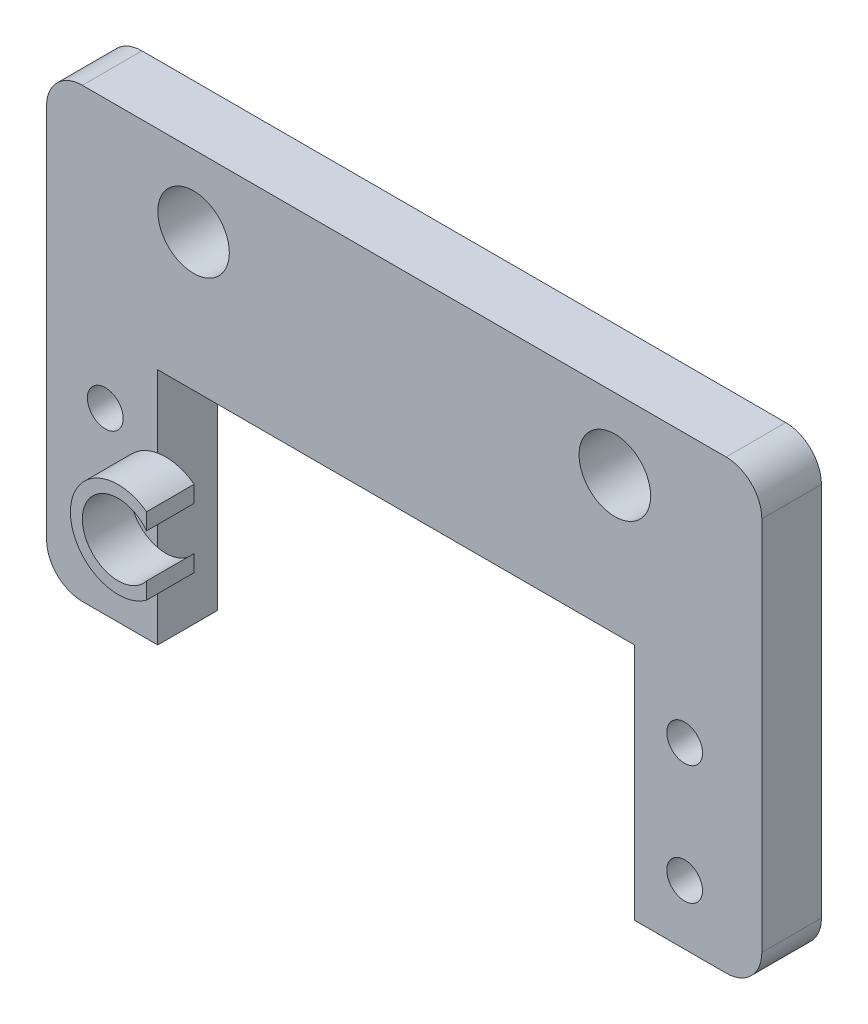
ISO-10303-21;
HEADER;
FILE_DESCRIPTION(('STEP AP214'),'2;1');
FILE_NAME('part.step','',(''),(''),'','','');
FILE_SCHEMA(('AUTOMOTIVE_DESIGN { 1 0 10303 214 1 1 1 1 }'));
ENDSEC;
DATA;
#1=APPLICATION_CONTEXT('core data for automotive mechanical design processes');
#2=APPLICATION_PROTOCOL_DEFINITION('international standard','automotive_design',2000,#1);
#3=PRODUCT_CONTEXT('',#1,'mechanical');
#4=PRODUCT('Part','Part','',(#3));
#5=PRODUCT_RELATED_PRODUCT_CATEGORY('part','',(#4));
#6=PRODUCT_DEFINITION_FORMATION('','',#4);
#7=PRODUCT_DEFINITION_CONTEXT('part definition',#1,'design');
#8=PRODUCT_DEFINITION('design','',#6,#7);
#9=PRODUCT_DEFINITION_SHAPE('','',#8);
#10=(LENGTH_UNIT() NAMED_UNIT(*) SI_UNIT(.MILLI.,.METRE.));
#11=(NAMED_UNIT(*) PLANE_ANGLE_UNIT() SI_UNIT($,.RADIAN.));
#12=(NAMED_UNIT(*) SI_UNIT($,.STERADIAN.) SOLID_ANGLE_UNIT());
#13=UNCERTAINTY_MEASURE_WITH_UNIT(LENGTH_MEASURE(1.E-05),#10,'distance_accuracy_value','');
#14=(GEOMETRIC_REPRESENTATION_CONTEXT(3) GLOBAL_UNCERTAINTY_ASSIGNED_CONTEXT((#13)) GLOBAL_UNIT_ASSIGNED_CONTEXT((#10,
#11,#12)) REPRESENTATION_CONTEXT('',''));
#15=CARTESIAN_POINT('',(0.,0.,0.));
#16=DIRECTION('',(0.,0.,1.));
#17=DIRECTION('',(1.,0.,0.));
#18=AXIS2_PLACEMENT_3D('',#15,#16,#17);
#19=CARTESIAN_POINT('',(-8.50000000000011,0.,5.));
#20=DIRECTION('',(0.,0.,1.));
#21=DIRECTION('',(1.,0.,0.));
#22=AXIS2_PLACEMENT_3D('',#19,#20,#21);
#23=PLANE('',#22);
#24=CARTESIAN_POINT('',(-8.50000000000011,0.,5.));
#25=DIRECTION('',(0.,0.,1.));
#26=DIRECTION('',(1.,0.,0.));
#27=AXIS2_PLACEMENT_3D('',#24,#25,#26);
#28=CIRCLE('',#27,4.);
#29=CARTESIAN_POINT('',(-6.1151179643437,3.21128287075482,5.));
#30=VERTEX_POINT('',#29);
#31=CARTESIAN_POINT('',(-9.17500000000001,3.94263553983882,5.));
#32=VERTEX_POINT('',#31);
#33=EDGE_CURVE('E185',#30,#32,#28,.T.);
#34=ORIENTED_EDGE('',*,*,#33,.F.);
#35=DIRECTION('',(0.,-1.,0.));
#36=VECTOR('',#35,1.);
#37=CARTESIAN_POINT('',(-6.1151179643437,3.21128287075482,5.));
#38=LINE('',#37,#36);
#39=CARTESIAN_POINT('',(-6.1151179643437,1.81998287794235,5.));
#40=VERTEX_POINT('',#39);
#41=EDGE_CURVE('E169',#30,#40,#38,.T.);
#42=ORIENTED_EDGE('',*,*,#41,.T.);
#43=CARTESIAN_POINT('',(-8.50000000000011,0.,5.));
#44=DIRECTION('',(0.,0.,1.));
#45=DIRECTION('',(1.,0.,0.));
#46=AXIS2_PLACEMENT_3D('',#43,#44,#45);
#47=CIRCLE('',#46,3.);
#48=CARTESIAN_POINT('',(-9.17500000000001,2.92307629048578,5.));
#49=VERTEX_POINT('',#48);
#50=EDGE_CURVE('E214',#40,#49,#47,.T.);
#51=ORIENTED_EDGE('',*,*,#50,.T.);
#52=DIRECTION('',(0.,1.,0.));
#53=VECTOR('',#52,1.);
#54=CARTESIAN_POINT('',(-9.17500000000001,10.,5.));
#55=LINE('',#54,#53);
#56=EDGE_CURVE('E188',#49,#32,#55,.T.);
#57=ORIENTED_EDGE('',*,*,#56,.T.);
#58=EDGE_LOOP('',(#34,#42,#51,#57));
#59=FACE_BOUND('',#58,.T.);
#60=ADVANCED_FACE('F50',(#59),#23,.F.);
#61=CARTESIAN_POINT('',(-15.5,-7.,5.));
#62=DIRECTION('',(0.,0.,1.));
#63=DIRECTION('',(1.,0.,0.));
#64=AXIS2_PLACEMENT_3D('',#61,#62,#63);
#65=PLANE('',#64);
#66=CARTESIAN_POINT('',(-9.17500000000001,-2.92307629048579,5.));
#67=VERTEX_POINT('',#66);
#68=EDGE_CURVE('E233',#67,#49,#55,.T.);
#69=ORIENTED_EDGE('',*,*,#68,.T.);
#70=EDGE_CURVE('E200',#49,#67,#47,.T.);
#71=ORIENTED_EDGE('',*,*,#70,.T.);
#72=EDGE_LOOP('',(#69,#71));
#73=FACE_BOUND('',#72,.T.);
#74=ADVANCED_FACE('F232',(#73),#65,.T.);
#75=CARTESIAN_POINT('',(-9.17500000000001,-3.94263553983882,5.));
#76=VERTEX_POINT('',#75);
#77=EDGE_CURVE('E192',#32,#76,#28,.T.);
#78=ORIENTED_EDGE('',*,*,#77,.F.);
#79=CARTESIAN_POINT('',(-9.17500000000001,10.,5.));
#80=VERTEX_POINT('',#79);
#81=EDGE_CURVE('E231',#32,#80,#55,.T.);
#82=ORIENTED_EDGE('',*,*,#81,.T.);
#83=DIRECTION('',(1.,0.,0.));
#84=VECTOR('',#83,1.);
#85=CARTESIAN_POINT('',(30.825,10.,5.));
#86=LINE('',#85,#84);
#87=CARTESIAN_POINT('',(30.825,10.,5.));
#88=VERTEX_POINT('',#87);
#89=EDGE_CURVE('E239',#80,#88,#86,.T.);
#90=ORIENTED_EDGE('',*,*,#89,.T.);
#91=DIRECTION('',(0.,-1.,0.));
#92=VECTOR('',#91,1.);
#93=CARTESIAN_POINT('',(30.825,10.,5.));
#94=LINE('',#93,#92);
#95=CARTESIAN_POINT('',(30.825,-9.99999999999999,5.));
#96=VERTEX_POINT('',#95);
#97=EDGE_CURVE('E242',#88,#96,#94,.T.);
#98=ORIENTED_EDGE('',*,*,#97,.T.);
#99=DIRECTION('',(1.,0.,0.));
#100=VECTOR('',#99,1.);
#101=CARTESIAN_POINT('',(33.3,-9.99999999999999,5.));
#102=LINE('',#101,#100);
#103=CARTESIAN_POINT('',(38.5,-9.99999999999999,5.));
#104=VERTEX_POINT('',#103);
#105=EDGE_CURVE('E271',#96,#104,#102,.T.);
#106=ORIENTED_EDGE('',*,*,#105,.T.);
#107=CARTESIAN_POINT('',(38.5,-6.99999999999999,5.));
#108=DIRECTION('',(0.,0.,1.));
#109=DIRECTION('',(1.,0.,0.));
#110=AXIS2_PLACEMENT_3D('',#107,#108,#109);
#111=CIRCLE('',#110,3.);
#112=CARTESIAN_POINT('',(41.5,-6.99999999999997,5.));
#113=VERTEX_POINT('',#112);
#114=EDGE_CURVE('E345',#104,#113,#111,.T.);
#115=ORIENTED_EDGE('',*,*,#114,.T.);
#116=DIRECTION('',(0.,1.,0.));
#117=VECTOR('',#116,1.);
#118=CARTESIAN_POINT('',(41.5,24.5,5.));
#119=LINE('',#118,#117);
#120=CARTESIAN_POINT('',(41.5,24.5,5.));
#121=VERTEX_POINT('',#120);
#122=EDGE_CURVE('E342',#113,#121,#119,.T.);
#123=ORIENTED_EDGE('',*,*,#122,.T.);
#124=CARTESIAN_POINT('',(38.5,24.5,5.));
#125=DIRECTION('',(0.,0.,1.));
#126=DIRECTION('',(-1.,0.,0.));
#127=AXIS2_PLACEMENT_3D('',#124,#125,#126);
#128=CIRCLE('',#127,3.);
#129=CARTESIAN_POINT('',(38.5,27.5,5.));
#130=VERTEX_POINT('',#129);
#131=EDGE_CURVE('E350',#121,#130,#128,.T.);
#132=ORIENTED_EDGE('',*,*,#131,.T.);
#133=DIRECTION('',(-1.,0.,0.));
#134=VECTOR('',#133,1.);
#135=CARTESIAN_POINT('',(-15.5,27.5,5.));
#136=LINE('',#135,#134);
#137=CARTESIAN_POINT('',(-15.5,27.5,5.));
#138=VERTEX_POINT('',#137);
#139=EDGE_CURVE('E349',#130,#138,#136,.T.);
#140=ORIENTED_EDGE('',*,*,#139,.T.);
#141=CARTESIAN_POINT('',(-15.5,24.5,5.));
#142=DIRECTION('',(0.,0.,1.));
#143=DIRECTION('',(1.,0.,0.));
#144=AXIS2_PLACEMENT_3D('',#141,#142,#143);
#145=CIRCLE('',#144,3.);
#146=CARTESIAN_POINT('',(-18.5,24.5,5.));
#147=VERTEX_POINT('',#146);
#148=EDGE_CURVE('E353',#138,#147,#145,.T.);
#149=ORIENTED_EDGE('',*,*,#148,.T.);
#150=DIRECTION('',(0.,-1.,0.));
#151=VECTOR('',#150,1.);
#152=CARTESIAN_POINT('',(-18.5,24.5,5.));
#153=LINE('',#152,#151);
#154=CARTESIAN_POINT('',(-18.5,-6.99999999999998,5.));
#155=VERTEX_POINT('',#154);
#156=EDGE_CURVE('E352',#147,#155,#153,.T.);
#157=ORIENTED_EDGE('',*,*,#156,.T.);
#158=CARTESIAN_POINT('',(-15.5,-7.,5.));
#159=DIRECTION('',(0.,0.,1.));
#160=DIRECTION('',(1.,0.,0.));
#161=AXIS2_PLACEMENT_3D('',#158,#159,#160);
#162=CIRCLE('',#161,3.);
#163=CARTESIAN_POINT('',(-15.5,-10.,5.));
#164=VERTEX_POINT('',#163);
#165=EDGE_CURVE('E355',#155,#164,#162,.T.);
#166=ORIENTED_EDGE('',*,*,#165,.T.);
#167=DIRECTION('',(1.,0.,0.));
#168=VECTOR('',#167,1.);
#169=CARTESIAN_POINT('',(-15.5,-10.,5.));
#170=LINE('',#169,#168);
#171=CARTESIAN_POINT('',(-9.17500000000001,-10.,5.));
#172=VERTEX_POINT('',#171);
#173=EDGE_CURVE('E241',#164,#172,#170,.T.);
#174=ORIENTED_EDGE('',*,*,#173,.T.);
#175=EDGE_CURVE('E236',#172,#76,#55,.T.);
#176=ORIENTED_EDGE('',*,*,#175,.T.);
#177=EDGE_LOOP('',(#78,#82,#90,#98,#106,#115,#123,#132,#140,#149,#157,#166,#174,#176));
#178=FACE_BOUND('',#177,.T.);
#179=CARTESIAN_POINT('',(-6.17,21.5,5.));
#180=DIRECTION('',(0.,0.,1.));
#181=DIRECTION('',(1.,0.,0.));
#182=AXIS2_PLACEMENT_3D('',#179,#180,#181);
#183=CIRCLE('',#182,3.);
#184=CARTESIAN_POINT('',(-3.17,21.5,5.));
#185=VERTEX_POINT('',#184);
#186=EDGE_CURVE('E207',#185,#185,#183,.T.);
#187=ORIENTED_EDGE('',*,*,#186,.F.);
#188=EDGE_LOOP('',(#187));
#189=FACE_BOUND('',#188,.T.);
#190=CARTESIAN_POINT('',(29.17,21.5,5.));
#191=DIRECTION('',(0.,0.,1.));
#192=DIRECTION('',(1.,0.,0.));
#193=AXIS2_PLACEMENT_3D('',#190,#191,#192);
#194=CIRCLE('',#193,3.);
#195=CARTESIAN_POINT('',(32.17,21.5,5.));
#196=VERTEX_POINT('',#195);
#197=EDGE_CURVE('E204',#196,#196,#194,.T.);
#198=ORIENTED_EDGE('',*,*,#197,.F.);
#199=EDGE_LOOP('',(#198));
#200=FACE_BOUND('',#199,.T.);
#201=CARTESIAN_POINT('',(35.025,5.,5.));
#202=DIRECTION('',(0.,0.,1.));
#203=DIRECTION('',(1.,0.,0.));
#204=AXIS2_PLACEMENT_3D('',#201,#202,#203);
#205=CIRCLE('',#204,1.5);
#206=CARTESIAN_POINT('',(36.525,5.,5.));
#207=VERTEX_POINT('',#206);
#208=EDGE_CURVE('E327',#207,#207,#205,.T.);
#209=ORIENTED_EDGE('',*,*,#208,.F.);
#210=EDGE_LOOP('',(#209));
#211=FACE_BOUND('',#210,.T.);
#212=CARTESIAN_POINT('',(-13.575,5.,5.));
#213=DIRECTION('',(0.,0.,1.));
#214=DIRECTION('',(1.,0.,0.));
#215=AXIS2_PLACEMENT_3D('',#212,#213,#214);
#216=CIRCLE('',#215,1.5);
#217=CARTESIAN_POINT('',(-12.075,5.,5.));
#218=VERTEX_POINT('',#217);
#219=EDGE_CURVE('E249',#218,#218,#216,.T.);
#220=ORIENTED_EDGE('',*,*,#219,.F.);
#221=EDGE_LOOP('',(#220));
#222=FACE_BOUND('',#221,.T.);
#223=CARTESIAN_POINT('',(-13.575,-5.00000000000001,5.));
#224=DIRECTION('',(0.,0.,1.));
#225=DIRECTION('',(1.,0.,0.));
#226=AXIS2_PLACEMENT_3D('',#223,#224,#225);
#227=CIRCLE('',#226,1.5);
#228=CARTESIAN_POINT('',(-12.075,-5.00000000000001,5.));
#229=VERTEX_POINT('',#228);
#230=EDGE_CURVE('E334',#229,#229,#227,.T.);
#231=ORIENTED_EDGE('',*,*,#230,.F.);
#232=EDGE_LOOP('',(#231));
#233=FACE_BOUND('',#232,.T.);
#234=CARTESIAN_POINT('',(35.025,-5.,5.));
#235=DIRECTION('',(0.,0.,1.));
#236=DIRECTION('',(1.,0.,0.));
#237=AXIS2_PLACEMENT_3D('',#234,#235,#236);
#238=CIRCLE('',#237,1.5);
#239=CARTESIAN_POINT('',(36.525,-5.,5.));
#240=VERTEX_POINT('',#239);
#241=EDGE_CURVE('E319',#240,#240,#238,.T.);
#242=ORIENTED_EDGE('',*,*,#241,.F.);
#243=EDGE_LOOP('',(#242));
#244=FACE_BOUND('',#243,.T.);
#245=ADVANCED_FACE('F359',(#178,#189,#200,#211,#222,#233,#244),#65,.T.);
#246=CARTESIAN_POINT('',(-15.5,-7.,0.));
#247=DIRECTION('',(0.,0.,1.));
#248=DIRECTION('',(1.,0.,0.));
#249=AXIS2_PLACEMENT_3D('',#246,#247,#248);
#250=PLANE('',#249);
#251=CARTESIAN_POINT('',(-6.17,21.5,0.));
#252=DIRECTION('',(0.,0.,1.));
#253=DIRECTION('',(1.,0.,0.));
#254=AXIS2_PLACEMENT_3D('',#251,#252,#253);
#255=CIRCLE('',#254,3.);
#256=CARTESIAN_POINT('',(-3.17,21.5,0.));
#257=VERTEX_POINT('',#256);
#258=EDGE_CURVE('E315',#257,#257,#255,.T.);
#259=ORIENTED_EDGE('',*,*,#258,.T.);
#260=EDGE_LOOP('',(#259));
#261=FACE_BOUND('',#260,.T.);
#262=CARTESIAN_POINT('',(29.17,21.5,0.));
#263=DIRECTION('',(0.,0.,1.));
#264=DIRECTION('',(1.,0.,0.));
#265=AXIS2_PLACEMENT_3D('',#262,#263,#264);
#266=CIRCLE('',#265,3.);
#267=CARTESIAN_POINT('',(32.17,21.5,0.));
#268=VERTEX_POINT('',#267);
#269=EDGE_CURVE('E307',#268,#268,#266,.T.);
#270=ORIENTED_EDGE('',*,*,#269,.T.);
#271=EDGE_LOOP('',(#270));
#272=FACE_BOUND('',#271,.T.);
#273=DIRECTION('',(1.,0.,0.));
#274=VECTOR('',#273,1.);
#275=CARTESIAN_POINT('',(33.3,-9.99999999999999,0.));
#276=LINE('',#275,#274);
#277=CARTESIAN_POINT('',(30.825,-9.99999999999999,0.));
#278=VERTEX_POINT('',#277);
#279=CARTESIAN_POINT('',(38.5,-9.99999999999999,0.));
#280=VERTEX_POINT('',#279);
#281=EDGE_CURVE('E250',#278,#280,#276,.T.);
#282=ORIENTED_EDGE('',*,*,#281,.F.);
#283=DIRECTION('',(0.,-1.,0.));
#284=VECTOR('',#283,1.);
#285=CARTESIAN_POINT('',(30.825,10.,0.));
#286=LINE('',#285,#284);
#287=CARTESIAN_POINT('',(30.825,10.,0.));
#288=VERTEX_POINT('',#287);
#289=EDGE_CURVE('E266',#288,#278,#286,.T.);
#290=ORIENTED_EDGE('',*,*,#289,.F.);
#291=DIRECTION('',(1.,0.,0.));
#292=VECTOR('',#291,1.);
#293=CARTESIAN_POINT('',(30.825,10.,0.));
#294=LINE('',#293,#292);
#295=CARTESIAN_POINT('',(-9.17500000000001,10.,0.));
#296=VERTEX_POINT('',#295);
#297=EDGE_CURVE('E267',#296,#288,#294,.T.);
#298=ORIENTED_EDGE('',*,*,#297,.F.);
#299=DIRECTION('',(0.,1.,0.));
#300=VECTOR('',#299,1.);
#301=CARTESIAN_POINT('',(-9.17500000000001,10.,0.));
#302=LINE('',#301,#300);
#303=CARTESIAN_POINT('',(-9.17500000000001,-10.,0.));
#304=VERTEX_POINT('',#303);
#305=EDGE_CURVE('E268',#304,#296,#302,.T.);
#306=ORIENTED_EDGE('',*,*,#305,.F.);
#307=DIRECTION('',(1.,0.,0.));
#308=VECTOR('',#307,1.);
#309=CARTESIAN_POINT('',(-15.5,-10.,0.));
#310=LINE('',#309,#308);
#311=CARTESIAN_POINT('',(-15.5,-10.,0.));
#312=VERTEX_POINT('',#311);
#313=EDGE_CURVE('E264',#312,#304,#310,.T.);
#314=ORIENTED_EDGE('',*,*,#313,.F.);
#315=CARTESIAN_POINT('',(-15.5,-7.,0.));
#316=DIRECTION('',(0.,0.,1.));
#317=DIRECTION('',(1.,0.,0.));
#318=AXIS2_PLACEMENT_3D('',#315,#316,#317);
#319=CIRCLE('',#318,3.);
#320=CARTESIAN_POINT('',(-18.5,-6.99999999999998,0.));
#321=VERTEX_POINT('',#320);
#322=EDGE_CURVE('E265',#321,#312,#319,.T.);
#323=ORIENTED_EDGE('',*,*,#322,.F.);
#324=DIRECTION('',(0.,-1.,0.));
#325=VECTOR('',#324,1.);
#326=CARTESIAN_POINT('',(-18.5,24.5,0.));
#327=LINE('',#326,#325);
#328=CARTESIAN_POINT('',(-18.5,24.5,0.));
#329=VERTEX_POINT('',#328);
#330=EDGE_CURVE('E257',#329,#321,#327,.T.);
#331=ORIENTED_EDGE('',*,*,#330,.F.);
#332=CARTESIAN_POINT('',(-15.5,24.5,0.));
#333=DIRECTION('',(0.,0.,1.));
#334=DIRECTION('',(1.,0.,0.));
#335=AXIS2_PLACEMENT_3D('',#332,#333,#334);
#336=CIRCLE('',#335,3.);
#337=CARTESIAN_POINT('',(-15.5,27.5,0.));
#338=VERTEX_POINT('',#337);
#339=EDGE_CURVE('E260',#338,#329,#336,.T.);
#340=ORIENTED_EDGE('',*,*,#339,.F.);
#341=DIRECTION('',(-1.,0.,0.));
#342=VECTOR('',#341,1.);
#343=CARTESIAN_POINT('',(-15.5,27.5,0.));
#344=LINE('',#343,#342);
#345=CARTESIAN_POINT('',(38.5,27.5,0.));
#346=VERTEX_POINT('',#345);
#347=EDGE_CURVE('E259',#346,#338,#344,.T.);
#348=ORIENTED_EDGE('',*,*,#347,.F.);
#349=CARTESIAN_POINT('',(38.5,24.5,0.));
#350=DIRECTION('',(0.,0.,1.));
#351=DIRECTION('',(-1.,0.,0.));
#352=AXIS2_PLACEMENT_3D('',#349,#350,#351);
#353=CIRCLE('',#352,3.);
#354=CARTESIAN_POINT('',(41.5,24.5,0.));
#355=VERTEX_POINT('',#354);
#356=EDGE_CURVE('E251',#355,#346,#353,.T.);
#357=ORIENTED_EDGE('',*,*,#356,.F.);
#358=DIRECTION('',(0.,1.,0.));
#359=VECTOR('',#358,1.);
#360=CARTESIAN_POINT('',(41.5,24.5,0.));
#361=LINE('',#360,#359);
#362=CARTESIAN_POINT('',(41.5,-6.99999999999997,0.));
#363=VERTEX_POINT('',#362);
#364=EDGE_CURVE('E255',#363,#355,#361,.T.);
#365=ORIENTED_EDGE('',*,*,#364,.F.);
#366=CARTESIAN_POINT('',(38.5,-6.99999999999999,0.));
#367=DIRECTION('',(0.,0.,1.));
#368=DIRECTION('',(1.,0.,0.));
#369=AXIS2_PLACEMENT_3D('',#366,#367,#368);
#370=CIRCLE('',#369,3.);
#371=EDGE_CURVE('E248',#280,#363,#370,.T.);
#372=ORIENTED_EDGE('',*,*,#371,.F.);
#373=EDGE_LOOP('',(#282,#290,#298,#306,#314,#323,#331,#340,#348,#357,#365,#372));
#374=FACE_BOUND('',#373,.T.);
#375=CARTESIAN_POINT('',(-13.575,5.,0.));
#376=DIRECTION('',(0.,0.,1.));
#377=DIRECTION('',(1.,0.,0.));
#378=AXIS2_PLACEMENT_3D('',#375,#376,#377);
#379=CIRCLE('',#378,1.5);
#380=CARTESIAN_POINT('',(-12.075,5.,0.));
#381=VERTEX_POINT('',#380);
#382=EDGE_CURVE('E331',#381,#381,#379,.T.);
#383=ORIENTED_EDGE('',*,*,#382,.T.);
#384=EDGE_LOOP('',(#383));
#385=FACE_BOUND('',#384,.T.);
#386=CARTESIAN_POINT('',(-13.575,-5.00000000000001,0.));
#387=DIRECTION('',(0.,0.,1.));
#388=DIRECTION('',(1.,0.,0.));
#389=AXIS2_PLACEMENT_3D('',#386,#387,#388);
#390=CIRCLE('',#389,1.5);
#391=CARTESIAN_POINT('',(-12.075,-5.00000000000001,0.));
#392=VERTEX_POINT('',#391);
#393=EDGE_CURVE('E329',#392,#392,#390,.T.);
#394=ORIENTED_EDGE('',*,*,#393,.T.);
#395=EDGE_LOOP('',(#394));
#396=FACE_BOUND('',#395,.T.);
#397=CARTESIAN_POINT('',(35.025,5.,0.));
#398=DIRECTION('',(0.,0.,1.));
#399=DIRECTION('',(1.,0.,0.));
#400=AXIS2_PLACEMENT_3D('',#397,#398,#399);
#401=CIRCLE('',#400,1.5);
#402=CARTESIAN_POINT('',(36.525,5.,0.));
#403=VERTEX_POINT('',#402);
#404=EDGE_CURVE('E325',#403,#403,#401,.T.);
#405=ORIENTED_EDGE('',*,*,#404,.T.);
#406=EDGE_LOOP('',(#405));
#407=FACE_BOUND('',#406,.T.);
#408=CARTESIAN_POINT('',(35.025,-5.,0.));
#409=DIRECTION('',(0.,0.,1.));
#410=DIRECTION('',(1.,0.,0.));
#411=AXIS2_PLACEMENT_3D('',#408,#409,#410);
#412=CIRCLE('',#411,1.5);
#413=CARTESIAN_POINT('',(36.525,-5.,0.));
#414=VERTEX_POINT('',#413);
#415=EDGE_CURVE('E313',#414,#414,#412,.T.);
#416=ORIENTED_EDGE('',*,*,#415,.T.);
#417=EDGE_LOOP('',(#416));
#418=FACE_BOUND('',#417,.T.);
#419=ADVANCED_FACE('F414',(#261,#272,#374,#385,#396,#407,#418),#250,.F.);
#420=CARTESIAN_POINT('',(33.3,-9.99999999999999,5.));
#421=DIRECTION('',(0.,1.,0.));
#422=DIRECTION('',(0.,0.,1.));
#423=AXIS2_PLACEMENT_3D('',#420,#421,#422);
#424=PLANE('',#423);
#425=ORIENTED_EDGE('',*,*,#281,.T.);
#426=DIRECTION('',(0.,0.,-1.));
#427=VECTOR('',#426,1.);
#428=CARTESIAN_POINT('',(38.5,-9.99999999999999,5.));
#429=LINE('',#428,#427);
#430=EDGE_CURVE('E306',#104,#280,#429,.T.);
#431=ORIENTED_EDGE('',*,*,#430,.F.);
#432=ORIENTED_EDGE('',*,*,#105,.F.);
#433=DIRECTION('',(0.,0.,-1.));
#434=VECTOR('',#433,1.);
#435=CARTESIAN_POINT('',(30.825,-9.99999999999999,5.));
#436=LINE('',#435,#434);
#437=EDGE_CURVE('E246',#96,#278,#436,.T.);
#438=ORIENTED_EDGE('',*,*,#437,.T.);
#439=EDGE_LOOP('',(#425,#431,#432,#438));
#440=FACE_BOUND('',#439,.T.);
#441=ADVANCED_FACE('F47',(#440),#424,.F.);
#442=CARTESIAN_POINT('',(38.5,-6.99999999999999,5.));
#443=DIRECTION('',(0.,0.,-1.));
#444=DIRECTION('',(-1.,0.,0.));
#445=AXIS2_PLACEMENT_3D('',#442,#443,#444);
#446=CYLINDRICAL_SURFACE('',#445,3.);
#447=ORIENTED_EDGE('',*,*,#371,.T.);
#448=DIRECTION('',(0.,0.,-1.));
#449=VECTOR('',#448,1.);
#450=CARTESIAN_POINT('',(41.5,-6.99999999999997,5.));
#451=LINE('',#450,#449);
#452=EDGE_CURVE('E303',#113,#363,#451,.T.);
#453=ORIENTED_EDGE('',*,*,#452,.F.);
#454=ORIENTED_EDGE('',*,*,#114,.F.);
#455=ORIENTED_EDGE('',*,*,#430,.T.);
#456=EDGE_LOOP('',(#447,#453,#454,#455));
#457=FACE_BOUND('',#456,.T.);
#458=ADVANCED_FACE('F379',(#457),#446,.T.);
#459=CARTESIAN_POINT('',(41.5,24.5,5.));
#460=DIRECTION('',(-1.,0.,0.));
#461=DIRECTION('',(0.,-1.,0.));
#462=AXIS2_PLACEMENT_3D('',#459,#460,#461);
#463=PLANE('',#462);
#464=ORIENTED_EDGE('',*,*,#364,.T.);
#465=DIRECTION('',(0.,0.,-1.));
#466=VECTOR('',#465,1.);
#467=CARTESIAN_POINT('',(41.5,24.5,5.));
#468=LINE('',#467,#466);
#469=EDGE_CURVE('E297',#121,#355,#468,.T.);
#470=ORIENTED_EDGE('',*,*,#469,.F.);
#471=ORIENTED_EDGE('',*,*,#122,.F.);
#472=ORIENTED_EDGE('',*,*,#452,.T.);
#473=EDGE_LOOP('',(#464,#470,#471,#472));
#474=FACE_BOUND('',#473,.T.);
#475=ADVANCED_FACE('F383',(#474),#463,.F.);
#476=CARTESIAN_POINT('',(38.5,24.5,5.));
#477=DIRECTION('',(0.,0.,-1.));
#478=DIRECTION('',(-1.,0.,0.));
#479=AXIS2_PLACEMENT_3D('',#476,#477,#478);
#480=CYLINDRICAL_SURFACE('',#479,3.);
#481=ORIENTED_EDGE('',*,*,#356,.T.);
#482=DIRECTION('',(0.,0.,-1.));
#483=VECTOR('',#482,1.);
#484=CARTESIAN_POINT('',(38.5,27.5,5.));
#485=LINE('',#484,#483);
#486=EDGE_CURVE('E300',#130,#346,#485,.T.);
#487=ORIENTED_EDGE('',*,*,#486,.F.);
#488=ORIENTED_EDGE('',*,*,#131,.F.);
#489=ORIENTED_EDGE('',*,*,#469,.T.);
#490=EDGE_LOOP('',(#481,#487,#488,#489));
#491=FACE_BOUND('',#490,.T.);
#492=ADVANCED_FACE('F392',(#491),#480,.T.);
#493=CARTESIAN_POINT('',(-15.5,27.5,5.));
#494=DIRECTION('',(0.,-1.,0.));
#495=DIRECTION('',(1.,0.,0.));
#496=AXIS2_PLACEMENT_3D('',#493,#494,#495);
#497=PLANE('',#496);
#498=ORIENTED_EDGE('',*,*,#347,.T.);
#499=DIRECTION('',(0.,0.,-1.));
#500=VECTOR('',#499,1.);
#501=CARTESIAN_POINT('',(-15.5,27.5,5.));
#502=LINE('',#501,#500);
#503=EDGE_CURVE('E295',#138,#338,#502,.T.);
#504=ORIENTED_EDGE('',*,*,#503,.F.);
#505=ORIENTED_EDGE('',*,*,#139,.F.);
#506=ORIENTED_EDGE('',*,*,#486,.T.);
#507=EDGE_LOOP('',(#498,#504,#505,#506));
#508=FACE_BOUND('',#507,.T.);
#509=ADVANCED_FACE('F391',(#508),#497,.F.);
#510=CARTESIAN_POINT('',(-15.5,24.5,5.));
#511=DIRECTION('',(0.,0.,-1.));
#512=DIRECTION('',(-1.,0.,0.));
#513=AXIS2_PLACEMENT_3D('',#510,#511,#512);
#514=CYLINDRICAL_SURFACE('',#513,3.);
#515=ORIENTED_EDGE('',*,*,#339,.T.);
#516=DIRECTION('',(0.,0.,-1.));
#517=VECTOR('',#516,1.);
#518=CARTESIAN_POINT('',(-18.5,24.5,5.));
#519=LINE('',#518,#517);
#520=EDGE_CURVE('E293',#147,#329,#519,.T.);
#521=ORIENTED_EDGE('',*,*,#520,.F.);
#522=ORIENTED_EDGE('',*,*,#148,.F.);
#523=ORIENTED_EDGE('',*,*,#503,.T.);
#524=EDGE_LOOP('',(#515,#521,#522,#523));
#525=FACE_BOUND('',#524,.T.);
#526=ADVANCED_FACE('F396',(#525),#514,.T.);
#527=CARTESIAN_POINT('',(-18.5,24.5,5.));
#528=DIRECTION('',(1.,0.,0.));
#529=DIRECTION('',(0.,1.,0.));
#530=AXIS2_PLACEMENT_3D('',#527,#528,#529);
#531=PLANE('',#530);
#532=ORIENTED_EDGE('',*,*,#330,.T.);
#533=DIRECTION('',(0.,0.,-1.));
#534=VECTOR('',#533,1.);
#535=CARTESIAN_POINT('',(-18.5,-6.99999999999998,5.));
#536=LINE('',#535,#534);
#537=EDGE_CURVE('E287',#155,#321,#536,.T.);
#538=ORIENTED_EDGE('',*,*,#537,.F.);
#539=ORIENTED_EDGE('',*,*,#156,.F.);
#540=ORIENTED_EDGE('',*,*,#520,.T.);
#541=EDGE_LOOP('',(#532,#538,#539,#540));
#542=FACE_BOUND('',#541,.T.);
#543=ADVANCED_FACE('F404',(#542),#531,.F.);
#544=CARTESIAN_POINT('',(-15.5,-7.,5.));
#545=DIRECTION('',(0.,0.,-1.));
#546=DIRECTION('',(-1.,0.,0.));
#547=AXIS2_PLACEMENT_3D('',#544,#545,#546);
#548=CYLINDRICAL_SURFACE('',#547,3.);
#549=ORIENTED_EDGE('',*,*,#322,.T.);
#550=DIRECTION('',(0.,0.,-1.));
#551=VECTOR('',#550,1.);
#552=CARTESIAN_POINT('',(-15.5,-10.,5.));
#553=LINE('',#552,#551);
#554=EDGE_CURVE('E281',#164,#312,#553,.T.);
#555=ORIENTED_EDGE('',*,*,#554,.F.);
#556=ORIENTED_EDGE('',*,*,#165,.F.);
#557=ORIENTED_EDGE('',*,*,#537,.T.);
#558=EDGE_LOOP('',(#549,#555,#556,#557));
#559=FACE_BOUND('',#558,.T.);
#560=ADVANCED_FACE('F410',(#559),#548,.T.);
#561=CARTESIAN_POINT('',(-15.5,-10.,5.));
#562=DIRECTION('',(0.,1.,0.));
#563=DIRECTION('',(0.,0.,1.));
#564=AXIS2_PLACEMENT_3D('',#561,#562,#563);
#565=PLANE('',#564);
#566=ORIENTED_EDGE('',*,*,#313,.T.);
#567=DIRECTION('',(0.,0.,-1.));
#568=VECTOR('',#567,1.);
#569=CARTESIAN_POINT('',(-9.17500000000001,-10.,5.));
#570=LINE('',#569,#568);
#571=EDGE_CURVE('E285',#172,#304,#570,.T.);
#572=ORIENTED_EDGE('',*,*,#571,.F.);
#573=ORIENTED_EDGE('',*,*,#173,.F.);
#574=ORIENTED_EDGE('',*,*,#554,.T.);
#575=EDGE_LOOP('',(#566,#572,#573,#574));
#576=FACE_BOUND('',#575,.T.);
#577=ADVANCED_FACE('F412',(#576),#565,.F.);
#578=CARTESIAN_POINT('',(-9.17500000000001,10.,5.));
#579=DIRECTION('',(-1.,0.,0.));
#580=DIRECTION('',(0.,-1.,0.));
#581=AXIS2_PLACEMENT_3D('',#578,#579,#580);
#582=PLANE('',#581);
#583=ORIENTED_EDGE('',*,*,#305,.T.);
#584=DIRECTION('',(0.,0.,-1.));
#585=VECTOR('',#584,1.);
#586=CARTESIAN_POINT('',(-9.17500000000001,10.,5.));
#587=LINE('',#586,#585);
#588=EDGE_CURVE('E278',#80,#296,#587,.T.);
#589=ORIENTED_EDGE('',*,*,#588,.F.);
#590=ORIENTED_EDGE('',*,*,#81,.F.);
#591=ORIENTED_EDGE('',*,*,#56,.F.);
#592=ORIENTED_EDGE('',*,*,#68,.F.);
#593=EDGE_CURVE('E223',#76,#67,#55,.T.);
#594=ORIENTED_EDGE('',*,*,#593,.F.);
#595=ORIENTED_EDGE('',*,*,#175,.F.);
#596=ORIENTED_EDGE('',*,*,#571,.T.);
#597=EDGE_LOOP('',(#583,#589,#590,#591,#592,#594,#595,#596));
#598=FACE_BOUND('',#597,.T.);
#599=ADVANCED_FACE('F229',(#598),#582,.F.);
#600=CARTESIAN_POINT('',(30.825,10.,5.));
#601=DIRECTION('',(0.,1.,0.));
#602=DIRECTION('',(-1.,0.,0.));
#603=AXIS2_PLACEMENT_3D('',#600,#601,#602);
#604=PLANE('',#603);
#605=ORIENTED_EDGE('',*,*,#297,.T.);
#606=DIRECTION('',(0.,0.,-1.));
#607=VECTOR('',#606,1.);
#608=CARTESIAN_POINT('',(30.825,10.,5.));
#609=LINE('',#608,#607);
#610=EDGE_CURVE('E279',#88,#288,#609,.T.);
#611=ORIENTED_EDGE('',*,*,#610,.F.);
#612=ORIENTED_EDGE('',*,*,#89,.F.);
#613=ORIENTED_EDGE('',*,*,#588,.T.);
#614=EDGE_LOOP('',(#605,#611,#612,#613));
#615=FACE_BOUND('',#614,.T.);
#616=ADVANCED_FACE('F370',(#615),#604,.F.);
#617=CARTESIAN_POINT('',(30.825,10.,5.));
#618=DIRECTION('',(1.,0.,0.));
#619=DIRECTION('',(0.,1.,0.));
#620=AXIS2_PLACEMENT_3D('',#617,#618,#619);
#621=PLANE('',#620);
#622=ORIENTED_EDGE('',*,*,#289,.T.);
#623=ORIENTED_EDGE('',*,*,#437,.F.);
#624=ORIENTED_EDGE('',*,*,#97,.F.);
#625=ORIENTED_EDGE('',*,*,#610,.T.);
#626=EDGE_LOOP('',(#622,#623,#624,#625));
#627=FACE_BOUND('',#626,.T.);
#628=ADVANCED_FACE('F375',(#627),#621,.F.);
#629=CARTESIAN_POINT('',(-13.575,5.,5.));
#630=DIRECTION('',(0.,0.,-1.));
#631=DIRECTION('',(-1.,0.,0.));
#632=AXIS2_PLACEMENT_3D('',#629,#630,#631);
#633=CYLINDRICAL_SURFACE('',#632,1.5);
#634=ORIENTED_EDGE('',*,*,#219,.T.);
#635=EDGE_LOOP('',(#634));
#636=FACE_BOUND('',#635,.T.);
#637=ORIENTED_EDGE('',*,*,#382,.F.);
#638=EDGE_LOOP('',(#637));
#639=FACE_BOUND('',#638,.T.);
#640=ADVANCED_FACE('F440',(#636,#639),#633,.F.);
#641=CARTESIAN_POINT('',(-13.575,-5.00000000000001,5.));
#642=DIRECTION('',(0.,0.,-1.));
#643=DIRECTION('',(-1.,0.,0.));
#644=AXIS2_PLACEMENT_3D('',#641,#642,#643);
#645=CYLINDRICAL_SURFACE('',#644,1.5);
#646=ORIENTED_EDGE('',*,*,#230,.T.);
#647=EDGE_LOOP('',(#646));
#648=FACE_BOUND('',#647,.T.);
#649=ORIENTED_EDGE('',*,*,#393,.F.);
#650=EDGE_LOOP('',(#649));
#651=FACE_BOUND('',#650,.T.);
#652=ADVANCED_FACE('F430',(#648,#651),#645,.F.);
#653=CARTESIAN_POINT('',(35.025,5.,5.));
#654=DIRECTION('',(0.,0.,-1.));
#655=DIRECTION('',(-1.,0.,0.));
#656=AXIS2_PLACEMENT_3D('',#653,#654,#655);
#657=CYLINDRICAL_SURFACE('',#656,1.5);
#658=ORIENTED_EDGE('',*,*,#208,.T.);
#659=EDGE_LOOP('',(#658));
#660=FACE_BOUND('',#659,.T.);
#661=ORIENTED_EDGE('',*,*,#404,.F.);
#662=EDGE_LOOP('',(#661));
#663=FACE_BOUND('',#662,.T.);
#664=ADVANCED_FACE('F425',(#660,#663),#657,.F.);
#665=CARTESIAN_POINT('',(35.025,-5.,5.));
#666=DIRECTION('',(0.,0.,-1.));
#667=DIRECTION('',(-1.,0.,0.));
#668=AXIS2_PLACEMENT_3D('',#665,#666,#667);
#669=CYLINDRICAL_SURFACE('',#668,1.5);
#670=ORIENTED_EDGE('',*,*,#241,.T.);
#671=EDGE_LOOP('',(#670));
#672=FACE_BOUND('',#671,.T.);
#673=ORIENTED_EDGE('',*,*,#415,.F.);
#674=EDGE_LOOP('',(#673));
#675=FACE_BOUND('',#674,.T.);
#676=ADVANCED_FACE('F428',(#672,#675),#669,.F.);
#677=CARTESIAN_POINT('',(29.17,21.5,-5.));
#678=DIRECTION('',(0.,0.,1.));
#679=DIRECTION('',(1.,0.,0.));
#680=AXIS2_PLACEMENT_3D('',#677,#678,#679);
#681=CYLINDRICAL_SURFACE('',#680,3.);
#682=ORIENTED_EDGE('',*,*,#197,.T.);
#683=EDGE_LOOP('',(#682));
#684=FACE_BOUND('',#683,.T.);
#685=ORIENTED_EDGE('',*,*,#269,.F.);
#686=EDGE_LOOP('',(#685));
#687=FACE_BOUND('',#686,.T.);
#688=ADVANCED_FACE('F432',(#684,#687),#681,.F.);
#689=CARTESIAN_POINT('',(-6.17,21.5,-5.));
#690=DIRECTION('',(0.,0.,1.));
#691=DIRECTION('',(1.,0.,0.));
#692=AXIS2_PLACEMENT_3D('',#689,#690,#691);
#693=CYLINDRICAL_SURFACE('',#692,3.);
#694=ORIENTED_EDGE('',*,*,#186,.T.);
#695=EDGE_LOOP('',(#694));
#696=FACE_BOUND('',#695,.T.);
#697=ORIENTED_EDGE('',*,*,#258,.F.);
#698=EDGE_LOOP('',(#697));
#699=FACE_BOUND('',#698,.T.);
#700=ADVANCED_FACE('F454',(#696,#699),#693,.F.);
#701=CARTESIAN_POINT('',(-6.1151179643437,-1.81998287794236,5.));
#702=VERTEX_POINT('',#701);
#703=EDGE_CURVE('E208',#67,#702,#47,.T.);
#704=ORIENTED_EDGE('',*,*,#703,.T.);
#705=CARTESIAN_POINT('',(-6.1151179643437,-3.21128287075482,5.));
#706=VERTEX_POINT('',#705);
#707=EDGE_CURVE('E61',#702,#706,#38,.T.);
#708=ORIENTED_EDGE('',*,*,#707,.T.);
#709=EDGE_CURVE('E191',#76,#706,#28,.T.);
#710=ORIENTED_EDGE('',*,*,#709,.F.);
#711=ORIENTED_EDGE('',*,*,#593,.T.);
#712=EDGE_LOOP('',(#704,#708,#710,#711));
#713=FACE_BOUND('',#712,.T.);
#714=ADVANCED_FACE('F216',(#713),#23,.F.);
#715=CARTESIAN_POINT('',(-8.50000000000011,0.,9.));
#716=DIRECTION('',(0.,0.,1.));
#717=DIRECTION('',(1.,0.,0.));
#718=AXIS2_PLACEMENT_3D('',#715,#716,#717);
#719=PLANE('',#718);
#720=DIRECTION('',(0.,-1.,0.));
#721=VECTOR('',#720,1.);
#722=CARTESIAN_POINT('',(-6.1151179643437,3.21128287075482,9.));
#723=LINE('',#722,#721);
#724=CARTESIAN_POINT('',(-6.1151179643437,3.21128287075482,9.));
#725=VERTEX_POINT('',#724);
#726=CARTESIAN_POINT('',(-6.1151179643437,1.81998287794235,9.));
#727=VERTEX_POINT('',#726);
#728=EDGE_CURVE('E69',#725,#727,#723,.T.);
#729=ORIENTED_EDGE('',*,*,#728,.F.);
#730=CARTESIAN_POINT('',(-8.50000000000011,0.,9.));
#731=DIRECTION('',(0.,0.,1.));
#732=DIRECTION('',(1.,0.,0.));
#733=AXIS2_PLACEMENT_3D('',#730,#731,#732);
#734=CIRCLE('',#733,4.);
#735=CARTESIAN_POINT('',(-6.1151179643437,-3.21128287075482,9.));
#736=VERTEX_POINT('',#735);
#737=EDGE_CURVE('E187',#725,#736,#734,.T.);
#738=ORIENTED_EDGE('',*,*,#737,.T.);
#739=CARTESIAN_POINT('',(-6.1151179643437,-1.81998287794236,9.));
#740=VERTEX_POINT('',#739);
#741=EDGE_CURVE('E213',#740,#736,#723,.T.);
#742=ORIENTED_EDGE('',*,*,#741,.F.);
#743=CARTESIAN_POINT('',(-8.50000000000011,0.,9.));
#744=DIRECTION('',(0.,0.,1.));
#745=DIRECTION('',(1.,0.,0.));
#746=AXIS2_PLACEMENT_3D('',#743,#744,#745);
#747=CIRCLE('',#746,3.);
#748=EDGE_CURVE('E195',#727,#740,#747,.T.);
#749=ORIENTED_EDGE('',*,*,#748,.F.);
#750=EDGE_LOOP('',(#729,#738,#742,#749));
#751=FACE_BOUND('',#750,.T.);
#752=ADVANCED_FACE('F448',(#751),#719,.T.);
#753=CARTESIAN_POINT('',(-8.50000000000011,0.,9.));
#754=DIRECTION('',(0.,0.,-1.));
#755=DIRECTION('',(-1.,0.,0.));
#756=AXIS2_PLACEMENT_3D('',#753,#754,#755);
#757=CYLINDRICAL_SURFACE('',#756,4.);
#758=ORIENTED_EDGE('',*,*,#709,.T.);
#759=DIRECTION('',(0.,0.,1.));
#760=VECTOR('',#759,1.);
#761=CARTESIAN_POINT('',(-6.1151179643437,-3.21128287075482,5.));
#762=LINE('',#761,#760);
#763=EDGE_CURVE('E190',#706,#736,#762,.T.);
#764=ORIENTED_EDGE('',*,*,#763,.T.);
#765=ORIENTED_EDGE('',*,*,#737,.F.);
#766=DIRECTION('',(0.,0.,1.));
#767=VECTOR('',#766,1.);
#768=CARTESIAN_POINT('',(-6.1151179643437,3.21128287075482,5.));
#769=LINE('',#768,#767);
#770=EDGE_CURVE('E175',#30,#725,#769,.T.);
#771=ORIENTED_EDGE('',*,*,#770,.F.);
#772=ORIENTED_EDGE('',*,*,#33,.T.);
#773=ORIENTED_EDGE('',*,*,#77,.T.);
#774=EDGE_LOOP('',(#758,#764,#765,#771,#772,#773));
#775=FACE_BOUND('',#774,.T.);
#776=ADVANCED_FACE('F179',(#775),#757,.T.);
#777=CARTESIAN_POINT('',(-8.50000000000011,0.,9.));
#778=DIRECTION('',(0.,0.,-1.));
#779=DIRECTION('',(-1.,0.,0.));
#780=AXIS2_PLACEMENT_3D('',#777,#778,#779);
#781=CYLINDRICAL_SURFACE('',#780,3.);
#782=DIRECTION('',(0.,0.,-1.));
#783=VECTOR('',#782,1.);
#784=CARTESIAN_POINT('',(-6.1151179643437,1.81998287794235,9.));
#785=LINE('',#784,#783);
#786=EDGE_CURVE('E12',#727,#40,#785,.T.);
#787=ORIENTED_EDGE('',*,*,#786,.F.);
#788=ORIENTED_EDGE('',*,*,#748,.T.);
#789=DIRECTION('',(0.,0.,-1.));
#790=VECTOR('',#789,1.);
#791=CARTESIAN_POINT('',(-6.1151179643437,-1.81998287794236,9.));
#792=LINE('',#791,#790);
#793=EDGE_CURVE('E54',#702,#740,#792,.F.);
#794=ORIENTED_EDGE('',*,*,#793,.F.);
#795=ORIENTED_EDGE('',*,*,#703,.F.);
#796=ORIENTED_EDGE('',*,*,#70,.F.);
#797=ORIENTED_EDGE('',*,*,#50,.F.);
#798=EDGE_LOOP('',(#787,#788,#794,#795,#796,#797));
#799=FACE_BOUND('',#798,.T.);
#800=ADVANCED_FACE('F225',(#799),#781,.F.);
#801=CARTESIAN_POINT('',(-6.1151179643437,3.21128287075482,5.));
#802=DIRECTION('',(-1.,0.,0.));
#803=DIRECTION('',(0.,0.,1.));
#804=AXIS2_PLACEMENT_3D('',#801,#802,#803);
#805=PLANE('',#804);
#806=ORIENTED_EDGE('',*,*,#793,.T.);
#807=ORIENTED_EDGE('',*,*,#741,.T.);
#808=ORIENTED_EDGE('',*,*,#763,.F.);
#809=ORIENTED_EDGE('',*,*,#707,.F.);
#810=EDGE_LOOP('',(#806,#807,#808,#809));
#811=FACE_BOUND('',#810,.T.);
#812=ADVANCED_FACE('F212',(#811),#805,.F.);
#813=ORIENTED_EDGE('',*,*,#786,.T.);
#814=ORIENTED_EDGE('',*,*,#41,.F.);
#815=ORIENTED_EDGE('',*,*,#770,.T.);
#816=ORIENTED_EDGE('',*,*,#728,.T.);
#817=EDGE_LOOP('',(#813,#814,#815,#816));
#818=FACE_BOUND('',#817,.T.);
#819=ADVANCED_FACE('F171',(#818),#805,.F.);
#820=CLOSED_SHELL('',(#60,#74,#245,#419,#441,#458,#475,#492,#509,#526,#543,#560,#577,#599,#616,
#628,#640,#652,#664,#676,#688,#700,#714,#752,#776,#800,#812,#819));
#821=MANIFOLD_SOLID_BREP('B2',#820);
#822=ADVANCED_BREP_SHAPE_REPRESENTATION('',(#18,#821),#14);
#823=SHAPE_DEFINITION_REPRESENTATION(#9,#822);
ENDSEC;
END-ISO-10303-21;
